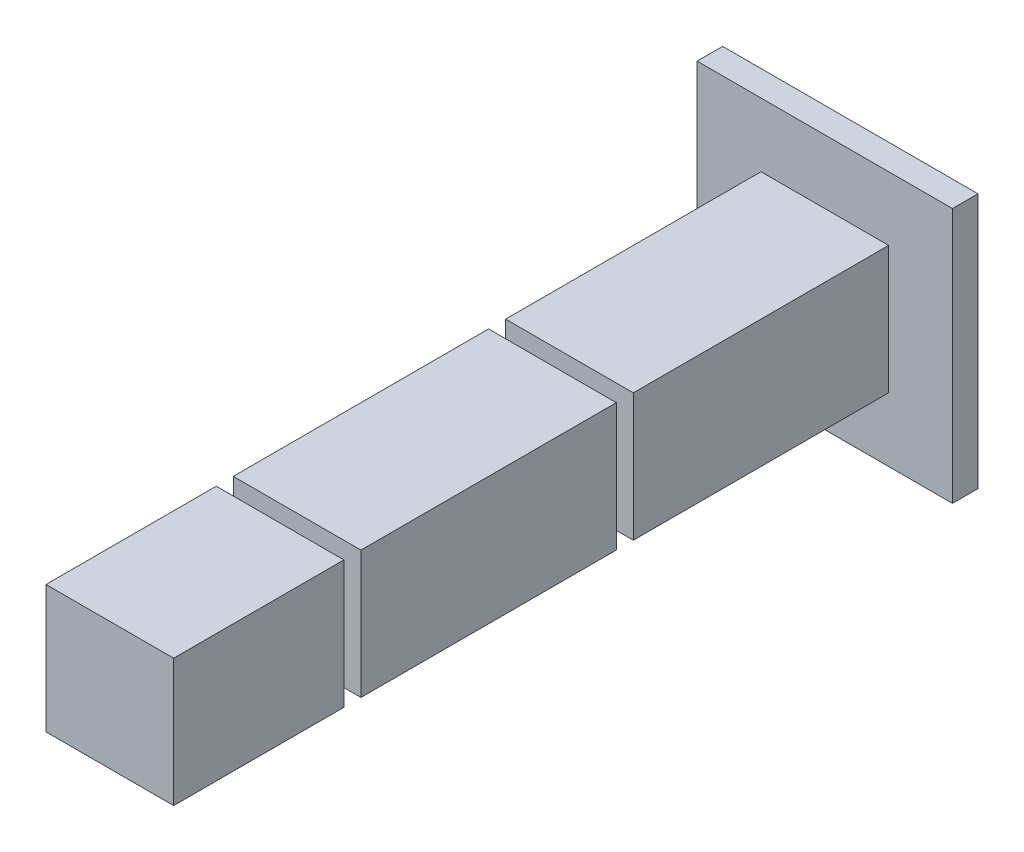
ISO-10303-21;
HEADER;
FILE_DESCRIPTION(('STEP AP214'),'2;1');
FILE_NAME('part.step','',(''),(''),'','','');
FILE_SCHEMA(('AUTOMOTIVE_DESIGN { 1 0 10303 214 1 1 1 1 }'));
ENDSEC;
DATA;
#1=APPLICATION_CONTEXT('core data for automotive mechanical design processes');
#2=APPLICATION_PROTOCOL_DEFINITION('international standard','automotive_design',2000,#1);
#3=PRODUCT_CONTEXT('',#1,'mechanical');
#4=PRODUCT('Part','Part','',(#3));
#5=PRODUCT_RELATED_PRODUCT_CATEGORY('part','',(#4));
#6=PRODUCT_DEFINITION_FORMATION('','',#4);
#7=PRODUCT_DEFINITION_CONTEXT('part definition',#1,'design');
#8=PRODUCT_DEFINITION('design','',#6,#7);
#9=PRODUCT_DEFINITION_SHAPE('','',#8);
#10=(LENGTH_UNIT() NAMED_UNIT(*) SI_UNIT(.MILLI.,.METRE.));
#11=(NAMED_UNIT(*) PLANE_ANGLE_UNIT() SI_UNIT($,.RADIAN.));
#12=(NAMED_UNIT(*) SI_UNIT($,.STERADIAN.) SOLID_ANGLE_UNIT());
#13=UNCERTAINTY_MEASURE_WITH_UNIT(LENGTH_MEASURE(1.E-05),#10,'distance_accuracy_value','');
#14=(GEOMETRIC_REPRESENTATION_CONTEXT(3) GLOBAL_UNCERTAINTY_ASSIGNED_CONTEXT((#13)) GLOBAL_UNIT_ASSIGNED_CONTEXT((#10,
#11,#12)) REPRESENTATION_CONTEXT('',''));
#15=CARTESIAN_POINT('',(0.,0.,0.));
#16=DIRECTION('',(0.,0.,1.));
#17=DIRECTION('',(1.,0.,0.));
#18=AXIS2_PLACEMENT_3D('',#15,#16,#17);
#19=CARTESIAN_POINT('',(0.,0.,157.5));
#20=DIRECTION('',(0.,0.,-1.));
#21=DIRECTION('',(-1.,0.,0.));
#22=AXIS2_PLACEMENT_3D('',#19,#20,#21);
#23=PLANE('',#22);
#24=DIRECTION('',(0.,1.,0.));
#25=VECTOR('',#24,1.);
#26=CARTESIAN_POINT('',(112.5,-37.5,157.5));
#27=LINE('',#26,#25);
#28=CARTESIAN_POINT('',(112.5,-37.5,157.5));
#29=VERTEX_POINT('',#28);
#30=CARTESIAN_POINT('',(112.5,37.5000000000001,157.5));
#31=VERTEX_POINT('',#30);
#32=EDGE_CURVE('E373',#29,#31,#27,.T.);
#33=ORIENTED_EDGE('',*,*,#32,.T.);
#34=DIRECTION('',(-1.,0.,0.));
#35=VECTOR('',#34,1.);
#36=CARTESIAN_POINT('',(37.5,37.5000000000001,157.5));
#37=LINE('',#36,#35);
#38=CARTESIAN_POINT('',(37.5,37.5000000000001,157.5));
#39=VERTEX_POINT('',#38);
#40=EDGE_CURVE('E377',#31,#39,#37,.T.);
#41=ORIENTED_EDGE('',*,*,#40,.T.);
#42=DIRECTION('',(0.,-1.,0.));
#43=VECTOR('',#42,1.);
#44=CARTESIAN_POINT('',(37.5,-37.5,157.5));
#45=LINE('',#44,#43);
#46=CARTESIAN_POINT('',(37.5,-37.5,157.5));
#47=VERTEX_POINT('',#46);
#48=EDGE_CURVE('E381',#39,#47,#45,.T.);
#49=ORIENTED_EDGE('',*,*,#48,.T.);
#50=DIRECTION('',(1.,0.,0.));
#51=VECTOR('',#50,1.);
#52=CARTESIAN_POINT('',(37.5,-37.5,157.5));
#53=LINE('',#52,#51);
#54=EDGE_CURVE('E384',#47,#29,#53,.T.);
#55=ORIENTED_EDGE('',*,*,#54,.T.);
#56=EDGE_LOOP('',(#33,#41,#49,#55));
#57=FACE_BOUND('',#56,.T.);
#58=DIRECTION('',(0.,1.,0.));
#59=VECTOR('',#58,1.);
#60=CARTESIAN_POINT('',(90.,-14.9999999999999,157.5));
#61=LINE('',#60,#59);
#62=CARTESIAN_POINT('',(90.,-14.9999999999999,157.5));
#63=VERTEX_POINT('',#62);
#64=CARTESIAN_POINT('',(90.,15.0000000000001,157.5));
#65=VERTEX_POINT('',#64);
#66=EDGE_CURVE('E324',#63,#65,#61,.T.);
#67=ORIENTED_EDGE('',*,*,#66,.F.);
#68=DIRECTION('',(1.,0.,0.));
#69=VECTOR('',#68,1.);
#70=CARTESIAN_POINT('',(60.,-14.9999999999999,157.5));
#71=LINE('',#70,#69);
#72=CARTESIAN_POINT('',(60.,-14.9999999999999,157.5));
#73=VERTEX_POINT('',#72);
#74=EDGE_CURVE('E330',#73,#63,#71,.T.);
#75=ORIENTED_EDGE('',*,*,#74,.F.);
#76=DIRECTION('',(0.,-1.,0.));
#77=VECTOR('',#76,1.);
#78=CARTESIAN_POINT('',(60.,-14.9999999999999,157.5));
#79=LINE('',#78,#77);
#80=CARTESIAN_POINT('',(60.,15.0000000000001,157.5));
#81=VERTEX_POINT('',#80);
#82=EDGE_CURVE('E350',#81,#73,#79,.T.);
#83=ORIENTED_EDGE('',*,*,#82,.F.);
#84=DIRECTION('',(-1.,0.,0.));
#85=VECTOR('',#84,1.);
#86=CARTESIAN_POINT('',(60.,15.0000000000001,157.5));
#87=LINE('',#86,#85);
#88=EDGE_CURVE('E346',#65,#81,#87,.T.);
#89=ORIENTED_EDGE('',*,*,#88,.F.);
#90=EDGE_LOOP('',(#67,#75,#83,#89));
#91=FACE_BOUND('',#90,.T.);
#92=ADVANCED_FACE('F45',(#57,#91),#23,.F.);
#93=CARTESIAN_POINT('',(150.,-75.,7.5));
#94=DIRECTION('',(0.,0.,-1.));
#95=DIRECTION('',(-1.,0.,0.));
#96=AXIS2_PLACEMENT_3D('',#93,#94,#95);
#97=PLANE('',#96);
#98=DIRECTION('',(0.,-1.,0.));
#99=VECTOR('',#98,1.);
#100=CARTESIAN_POINT('',(0.,-75.,7.5));
#101=LINE('',#100,#99);
#102=CARTESIAN_POINT('',(0.,75.,7.5));
#103=VERTEX_POINT('',#102);
#104=CARTESIAN_POINT('',(0.,-75.,7.5));
#105=VERTEX_POINT('',#104);
#106=EDGE_CURVE('E436',#103,#105,#101,.T.);
#107=ORIENTED_EDGE('',*,*,#106,.T.);
#108=DIRECTION('',(-1.,0.,0.));
#109=VECTOR('',#108,1.);
#110=CARTESIAN_POINT('',(150.,-75.,7.5));
#111=LINE('',#110,#109);
#112=CARTESIAN_POINT('',(150.,-75.,7.5));
#113=VERTEX_POINT('',#112);
#114=EDGE_CURVE('E54',#113,#105,#111,.T.);
#115=ORIENTED_EDGE('',*,*,#114,.F.);
#116=DIRECTION('',(0.,-1.,0.));
#117=VECTOR('',#116,1.);
#118=CARTESIAN_POINT('',(150.,-75.,7.5));
#119=LINE('',#118,#117);
#120=CARTESIAN_POINT('',(150.,75.,7.5));
#121=VERTEX_POINT('',#120);
#122=EDGE_CURVE('E422',#121,#113,#119,.T.);
#123=ORIENTED_EDGE('',*,*,#122,.F.);
#124=DIRECTION('',(-1.,0.,0.));
#125=VECTOR('',#124,1.);
#126=CARTESIAN_POINT('',(150.,75.,7.5));
#127=LINE('',#126,#125);
#128=EDGE_CURVE('E11',#121,#103,#127,.T.);
#129=ORIENTED_EDGE('',*,*,#128,.T.);
#130=EDGE_LOOP('',(#107,#115,#123,#129));
#131=FACE_BOUND('',#130,.T.);
#132=DIRECTION('',(0.,1.,0.));
#133=VECTOR('',#132,1.);
#134=CARTESIAN_POINT('',(112.5,-37.5,7.5));
#135=LINE('',#134,#133);
#136=CARTESIAN_POINT('',(112.5,-37.5,7.5));
#137=VERTEX_POINT('',#136);
#138=CARTESIAN_POINT('',(112.5,37.5000000000001,7.5));
#139=VERTEX_POINT('',#138);
#140=EDGE_CURVE('E372',#137,#139,#135,.T.);
#141=ORIENTED_EDGE('',*,*,#140,.F.);
#142=DIRECTION('',(1.,0.,0.));
#143=VECTOR('',#142,1.);
#144=CARTESIAN_POINT('',(37.5,-37.5,7.5));
#145=LINE('',#144,#143);
#146=CARTESIAN_POINT('',(37.5,-37.5,7.5));
#147=VERTEX_POINT('',#146);
#148=EDGE_CURVE('E378',#147,#137,#145,.T.);
#149=ORIENTED_EDGE('',*,*,#148,.F.);
#150=DIRECTION('',(0.,-1.,0.));
#151=VECTOR('',#150,1.);
#152=CARTESIAN_POINT('',(37.5,-37.5,7.5));
#153=LINE('',#152,#151);
#154=CARTESIAN_POINT('',(37.5,37.5000000000001,7.5));
#155=VERTEX_POINT('',#154);
#156=EDGE_CURVE('E395',#155,#147,#153,.T.);
#157=ORIENTED_EDGE('',*,*,#156,.F.);
#158=DIRECTION('',(-1.,0.,0.));
#159=VECTOR('',#158,1.);
#160=CARTESIAN_POINT('',(37.5,37.5000000000001,7.5));
#161=LINE('',#160,#159);
#162=EDGE_CURVE('E391',#139,#155,#161,.T.);
#163=ORIENTED_EDGE('',*,*,#162,.F.);
#164=EDGE_LOOP('',(#141,#149,#157,#163));
#165=FACE_BOUND('',#164,.T.);
#166=ADVANCED_FACE('F472',(#131,#165),#97,.F.);
#167=CARTESIAN_POINT('',(150.,75.,-7.5));
#168=DIRECTION('',(0.,-1.,0.));
#169=DIRECTION('',(0.,0.,-1.));
#170=AXIS2_PLACEMENT_3D('',#167,#168,#169);
#171=PLANE('',#170);
#172=DIRECTION('',(0.,0.,1.));
#173=VECTOR('',#172,1.);
#174=CARTESIAN_POINT('',(0.,75.,-7.5));
#175=LINE('',#174,#173);
#176=CARTESIAN_POINT('',(0.,75.,-7.5));
#177=VERTEX_POINT('',#176);
#178=EDGE_CURVE('E417',#177,#103,#175,.T.);
#179=ORIENTED_EDGE('',*,*,#178,.T.);
#180=ORIENTED_EDGE('',*,*,#128,.F.);
#181=DIRECTION('',(0.,0.,1.));
#182=VECTOR('',#181,1.);
#183=CARTESIAN_POINT('',(150.,75.,-7.5));
#184=LINE('',#183,#182);
#185=CARTESIAN_POINT('',(150.,75.,-7.5));
#186=VERTEX_POINT('',#185);
#187=EDGE_CURVE('E418',#186,#121,#184,.T.);
#188=ORIENTED_EDGE('',*,*,#187,.F.);
#189=DIRECTION('',(-1.,0.,0.));
#190=VECTOR('',#189,1.);
#191=CARTESIAN_POINT('',(150.,75.,-7.5));
#192=LINE('',#191,#190);
#193=EDGE_CURVE('E432',#186,#177,#192,.T.);
#194=ORIENTED_EDGE('',*,*,#193,.T.);
#195=EDGE_LOOP('',(#179,#180,#188,#194));
#196=FACE_BOUND('',#195,.T.);
#197=ADVANCED_FACE('F47',(#196),#171,.F.);
#198=CARTESIAN_POINT('',(150.,-75.,-7.5));
#199=DIRECTION('',(0.,1.,0.));
#200=DIRECTION('',(0.,0.,1.));
#201=AXIS2_PLACEMENT_3D('',#198,#199,#200);
#202=PLANE('',#201);
#203=DIRECTION('',(0.,0.,-1.));
#204=VECTOR('',#203,1.);
#205=CARTESIAN_POINT('',(0.,-75.,-7.5));
#206=LINE('',#205,#204);
#207=CARTESIAN_POINT('',(0.,-75.,-7.5));
#208=VERTEX_POINT('',#207);
#209=EDGE_CURVE('E439',#105,#208,#206,.T.);
#210=ORIENTED_EDGE('',*,*,#209,.T.);
#211=DIRECTION('',(-1.,0.,0.));
#212=VECTOR('',#211,1.);
#213=CARTESIAN_POINT('',(150.,-75.,-7.5));
#214=LINE('',#213,#212);
#215=CARTESIAN_POINT('',(150.,-75.,-7.5));
#216=VERTEX_POINT('',#215);
#217=EDGE_CURVE('E447',#216,#208,#214,.T.);
#218=ORIENTED_EDGE('',*,*,#217,.F.);
#219=DIRECTION('',(0.,0.,-1.));
#220=VECTOR('',#219,1.);
#221=CARTESIAN_POINT('',(150.,-75.,-7.5));
#222=LINE('',#221,#220);
#223=EDGE_CURVE('E426',#113,#216,#222,.T.);
#224=ORIENTED_EDGE('',*,*,#223,.F.);
#225=ORIENTED_EDGE('',*,*,#114,.T.);
#226=EDGE_LOOP('',(#210,#218,#224,#225));
#227=FACE_BOUND('',#226,.T.);
#228=ADVANCED_FACE('F456',(#227),#202,.F.);
#229=CARTESIAN_POINT('',(150.,-75.,-7.5));
#230=DIRECTION('',(0.,0.,1.));
#231=DIRECTION('',(1.,0.,0.));
#232=AXIS2_PLACEMENT_3D('',#229,#230,#231);
#233=PLANE('',#232);
#234=DIRECTION('',(0.,1.,0.));
#235=VECTOR('',#234,1.);
#236=CARTESIAN_POINT('',(0.,-75.,-7.5));
#237=LINE('',#236,#235);
#238=EDGE_CURVE('E423',#208,#177,#237,.T.);
#239=ORIENTED_EDGE('',*,*,#238,.T.);
#240=ORIENTED_EDGE('',*,*,#193,.F.);
#241=DIRECTION('',(0.,1.,0.));
#242=VECTOR('',#241,1.);
#243=CARTESIAN_POINT('',(150.,-75.,-7.5));
#244=LINE('',#243,#242);
#245=EDGE_CURVE('E429',#216,#186,#244,.T.);
#246=ORIENTED_EDGE('',*,*,#245,.F.);
#247=ORIENTED_EDGE('',*,*,#217,.T.);
#248=EDGE_LOOP('',(#239,#240,#246,#247));
#249=FACE_BOUND('',#248,.T.);
#250=ADVANCED_FACE('F465',(#249),#233,.F.);
#251=CARTESIAN_POINT('',(150.,0.,0.));
#252=DIRECTION('',(-1.,0.,0.));
#253=DIRECTION('',(0.,0.,1.));
#254=AXIS2_PLACEMENT_3D('',#251,#252,#253);
#255=PLANE('',#254);
#256=ORIENTED_EDGE('',*,*,#187,.T.);
#257=ORIENTED_EDGE('',*,*,#122,.T.);
#258=ORIENTED_EDGE('',*,*,#223,.T.);
#259=ORIENTED_EDGE('',*,*,#245,.T.);
#260=EDGE_LOOP('',(#256,#257,#258,#259));
#261=FACE_BOUND('',#260,.T.);
#262=ADVANCED_FACE('F471',(#261),#255,.F.);
#263=CARTESIAN_POINT('',(0.,0.,0.));
#264=DIRECTION('',(-1.,0.,0.));
#265=DIRECTION('',(0.,0.,1.));
#266=AXIS2_PLACEMENT_3D('',#263,#264,#265);
#267=PLANE('',#266);
#268=ORIENTED_EDGE('',*,*,#178,.F.);
#269=ORIENTED_EDGE('',*,*,#238,.F.);
#270=ORIENTED_EDGE('',*,*,#209,.F.);
#271=ORIENTED_EDGE('',*,*,#106,.F.);
#272=EDGE_LOOP('',(#268,#269,#270,#271));
#273=FACE_BOUND('',#272,.T.);
#274=ADVANCED_FACE('F462',(#273),#267,.T.);
#275=CARTESIAN_POINT('',(112.5,-37.5,157.5));
#276=DIRECTION('',(-1.,0.,0.));
#277=DIRECTION('',(0.,0.,1.));
#278=AXIS2_PLACEMENT_3D('',#275,#276,#277);
#279=PLANE('',#278);
#280=ORIENTED_EDGE('',*,*,#140,.T.);
#281=DIRECTION('',(0.,0.,-1.));
#282=VECTOR('',#281,1.);
#283=CARTESIAN_POINT('',(112.5,37.5000000000001,157.5));
#284=LINE('',#283,#282);
#285=EDGE_CURVE('E413',#31,#139,#284,.T.);
#286=ORIENTED_EDGE('',*,*,#285,.F.);
#287=ORIENTED_EDGE('',*,*,#32,.F.);
#288=DIRECTION('',(0.,0.,-1.));
#289=VECTOR('',#288,1.);
#290=CARTESIAN_POINT('',(112.5,-37.5,157.5));
#291=LINE('',#290,#289);
#292=EDGE_CURVE('E387',#29,#137,#291,.T.);
#293=ORIENTED_EDGE('',*,*,#292,.T.);
#294=EDGE_LOOP('',(#280,#286,#287,#293));
#295=FACE_BOUND('',#294,.T.);
#296=ADVANCED_FACE('F483',(#295),#279,.F.);
#297=CARTESIAN_POINT('',(37.5,37.5000000000001,157.5));
#298=DIRECTION('',(0.,-1.,0.));
#299=DIRECTION('',(0.,0.,-1.));
#300=AXIS2_PLACEMENT_3D('',#297,#298,#299);
#301=PLANE('',#300);
#302=ORIENTED_EDGE('',*,*,#162,.T.);
#303=DIRECTION('',(0.,0.,-1.));
#304=VECTOR('',#303,1.);
#305=CARTESIAN_POINT('',(37.5,37.5000000000001,157.5));
#306=LINE('',#305,#304);
#307=EDGE_CURVE('E409',#39,#155,#306,.T.);
#308=ORIENTED_EDGE('',*,*,#307,.F.);
#309=ORIENTED_EDGE('',*,*,#40,.F.);
#310=ORIENTED_EDGE('',*,*,#285,.T.);
#311=EDGE_LOOP('',(#302,#308,#309,#310));
#312=FACE_BOUND('',#311,.T.);
#313=ADVANCED_FACE('F491',(#312),#301,.F.);
#314=CARTESIAN_POINT('',(37.5,-37.5,157.5));
#315=DIRECTION('',(1.,0.,0.));
#316=DIRECTION('',(0.,0.,-1.));
#317=AXIS2_PLACEMENT_3D('',#314,#315,#316);
#318=PLANE('',#317);
#319=ORIENTED_EDGE('',*,*,#156,.T.);
#320=DIRECTION('',(0.,0.,-1.));
#321=VECTOR('',#320,1.);
#322=CARTESIAN_POINT('',(37.5,-37.5,157.5));
#323=LINE('',#322,#321);
#324=EDGE_CURVE('E405',#47,#147,#323,.T.);
#325=ORIENTED_EDGE('',*,*,#324,.F.);
#326=ORIENTED_EDGE('',*,*,#48,.F.);
#327=ORIENTED_EDGE('',*,*,#307,.T.);
#328=EDGE_LOOP('',(#319,#325,#326,#327));
#329=FACE_BOUND('',#328,.T.);
#330=ADVANCED_FACE('F489',(#329),#318,.F.);
#331=CARTESIAN_POINT('',(37.5,-37.5,157.5));
#332=DIRECTION('',(0.,1.,0.));
#333=DIRECTION('',(0.,0.,1.));
#334=AXIS2_PLACEMENT_3D('',#331,#332,#333);
#335=PLANE('',#334);
#336=ORIENTED_EDGE('',*,*,#148,.T.);
#337=ORIENTED_EDGE('',*,*,#292,.F.);
#338=ORIENTED_EDGE('',*,*,#54,.F.);
#339=ORIENTED_EDGE('',*,*,#324,.T.);
#340=EDGE_LOOP('',(#336,#337,#338,#339));
#341=FACE_BOUND('',#340,.T.);
#342=ADVANCED_FACE('F479',(#341),#335,.F.);
#343=CARTESIAN_POINT('',(90.,-14.9999999999999,167.5));
#344=DIRECTION('',(-1.,0.,0.));
#345=DIRECTION('',(0.,0.,1.));
#346=AXIS2_PLACEMENT_3D('',#343,#344,#345);
#347=PLANE('',#346);
#348=ORIENTED_EDGE('',*,*,#66,.T.);
#349=DIRECTION('',(0.,0.,-1.));
#350=VECTOR('',#349,1.);
#351=CARTESIAN_POINT('',(90.,15.0000000000001,167.5));
#352=LINE('',#351,#350);
#353=CARTESIAN_POINT('',(90.,15.0000000000001,167.5));
#354=VERTEX_POINT('',#353);
#355=EDGE_CURVE('E368',#354,#65,#352,.T.);
#356=ORIENTED_EDGE('',*,*,#355,.F.);
#357=DIRECTION('',(0.,1.,0.));
#358=VECTOR('',#357,1.);
#359=CARTESIAN_POINT('',(90.,-14.9999999999999,167.5));
#360=LINE('',#359,#358);
#361=CARTESIAN_POINT('',(90.,-14.9999999999999,167.5));
#362=VERTEX_POINT('',#361);
#363=EDGE_CURVE('E325',#362,#354,#360,.T.);
#364=ORIENTED_EDGE('',*,*,#363,.F.);
#365=DIRECTION('',(0.,0.,-1.));
#366=VECTOR('',#365,1.);
#367=CARTESIAN_POINT('',(90.,-14.9999999999999,167.5));
#368=LINE('',#367,#366);
#369=EDGE_CURVE('E342',#362,#63,#368,.T.);
#370=ORIENTED_EDGE('',*,*,#369,.T.);
#371=EDGE_LOOP('',(#348,#356,#364,#370));
#372=FACE_BOUND('',#371,.T.);
#373=ADVANCED_FACE('F508',(#372),#347,.F.);
#374=CARTESIAN_POINT('',(60.,15.0000000000001,167.5));
#375=DIRECTION('',(0.,-1.,0.));
#376=DIRECTION('',(0.,0.,-1.));
#377=AXIS2_PLACEMENT_3D('',#374,#375,#376);
#378=PLANE('',#377);
#379=ORIENTED_EDGE('',*,*,#88,.T.);
#380=DIRECTION('',(0.,0.,-1.));
#381=VECTOR('',#380,1.);
#382=CARTESIAN_POINT('',(60.,15.0000000000001,167.5));
#383=LINE('',#382,#381);
#384=CARTESIAN_POINT('',(60.,15.0000000000001,167.5));
#385=VERTEX_POINT('',#384);
#386=EDGE_CURVE('E364',#385,#81,#383,.T.);
#387=ORIENTED_EDGE('',*,*,#386,.F.);
#388=DIRECTION('',(-1.,0.,0.));
#389=VECTOR('',#388,1.);
#390=CARTESIAN_POINT('',(60.,15.0000000000001,167.5));
#391=LINE('',#390,#389);
#392=EDGE_CURVE('E329',#354,#385,#391,.T.);
#393=ORIENTED_EDGE('',*,*,#392,.F.);
#394=ORIENTED_EDGE('',*,*,#355,.T.);
#395=EDGE_LOOP('',(#379,#387,#393,#394));
#396=FACE_BOUND('',#395,.T.);
#397=ADVANCED_FACE('F512',(#396),#378,.F.);
#398=CARTESIAN_POINT('',(60.,-14.9999999999999,167.5));
#399=DIRECTION('',(1.,0.,0.));
#400=DIRECTION('',(0.,0.,-1.));
#401=AXIS2_PLACEMENT_3D('',#398,#399,#400);
#402=PLANE('',#401);
#403=ORIENTED_EDGE('',*,*,#82,.T.);
#404=DIRECTION('',(0.,0.,-1.));
#405=VECTOR('',#404,1.);
#406=CARTESIAN_POINT('',(60.,-14.9999999999999,167.5));
#407=LINE('',#406,#405);
#408=CARTESIAN_POINT('',(60.,-14.9999999999999,167.5));
#409=VERTEX_POINT('',#408);
#410=EDGE_CURVE('E360',#409,#73,#407,.T.);
#411=ORIENTED_EDGE('',*,*,#410,.F.);
#412=DIRECTION('',(0.,-1.,0.));
#413=VECTOR('',#412,1.);
#414=CARTESIAN_POINT('',(60.,-14.9999999999999,167.5));
#415=LINE('',#414,#413);
#416=EDGE_CURVE('E334',#385,#409,#415,.T.);
#417=ORIENTED_EDGE('',*,*,#416,.F.);
#418=ORIENTED_EDGE('',*,*,#386,.T.);
#419=EDGE_LOOP('',(#403,#411,#417,#418));
#420=FACE_BOUND('',#419,.T.);
#421=ADVANCED_FACE('F517',(#420),#402,.F.);
#422=CARTESIAN_POINT('',(60.,-14.9999999999999,167.5));
#423=DIRECTION('',(0.,1.,0.));
#424=DIRECTION('',(0.,0.,1.));
#425=AXIS2_PLACEMENT_3D('',#422,#423,#424);
#426=PLANE('',#425);
#427=ORIENTED_EDGE('',*,*,#74,.T.);
#428=ORIENTED_EDGE('',*,*,#369,.F.);
#429=DIRECTION('',(1.,0.,0.));
#430=VECTOR('',#429,1.);
#431=CARTESIAN_POINT('',(60.,-14.9999999999999,167.5));
#432=LINE('',#431,#430);
#433=EDGE_CURVE('E338',#409,#362,#432,.T.);
#434=ORIENTED_EDGE('',*,*,#433,.F.);
#435=ORIENTED_EDGE('',*,*,#410,.T.);
#436=EDGE_LOOP('',(#427,#428,#434,#435));
#437=FACE_BOUND('',#436,.T.);
#438=ADVANCED_FACE('F522',(#437),#426,.F.);
#439=CARTESIAN_POINT('',(0.,0.,167.5));
#440=DIRECTION('',(0.,0.,1.));
#441=DIRECTION('',(1.,0.,0.));
#442=AXIS2_PLACEMENT_3D('',#439,#440,#441);
#443=PLANE('',#442);
#444=DIRECTION('',(1.,0.,0.));
#445=VECTOR('',#444,1.);
#446=CARTESIAN_POINT('',(37.5,-37.5,167.5));
#447=LINE('',#446,#445);
#448=CARTESIAN_POINT('',(37.5,-37.5,167.5));
#449=VERTEX_POINT('',#448);
#450=CARTESIAN_POINT('',(112.5,-37.5,167.5));
#451=VERTEX_POINT('',#450);
#452=EDGE_CURVE('E282',#449,#451,#447,.T.);
#453=ORIENTED_EDGE('',*,*,#452,.F.);
#454=DIRECTION('',(0.,-1.,0.));
#455=VECTOR('',#454,1.);
#456=CARTESIAN_POINT('',(37.5,37.5000000000001,167.5));
#457=LINE('',#456,#455);
#458=CARTESIAN_POINT('',(37.5,37.5000000000001,167.5));
#459=VERTEX_POINT('',#458);
#460=EDGE_CURVE('E288',#459,#449,#457,.T.);
#461=ORIENTED_EDGE('',*,*,#460,.F.);
#462=DIRECTION('',(-1.,0.,0.));
#463=VECTOR('',#462,1.);
#464=CARTESIAN_POINT('',(112.5,37.5000000000001,167.5));
#465=LINE('',#464,#463);
#466=CARTESIAN_POINT('',(112.5,37.5000000000001,167.5));
#467=VERTEX_POINT('',#466);
#468=EDGE_CURVE('E304',#467,#459,#465,.T.);
#469=ORIENTED_EDGE('',*,*,#468,.F.);
#470=DIRECTION('',(0.,1.,0.));
#471=VECTOR('',#470,1.);
#472=CARTESIAN_POINT('',(112.5,-37.5,167.5));
#473=LINE('',#472,#471);
#474=EDGE_CURVE('E301',#451,#467,#473,.T.);
#475=ORIENTED_EDGE('',*,*,#474,.F.);
#476=EDGE_LOOP('',(#453,#461,#469,#475));
#477=FACE_BOUND('',#476,.T.);
#478=ORIENTED_EDGE('',*,*,#433,.T.);
#479=ORIENTED_EDGE('',*,*,#363,.T.);
#480=ORIENTED_EDGE('',*,*,#392,.T.);
#481=ORIENTED_EDGE('',*,*,#416,.T.);
#482=EDGE_LOOP('',(#478,#479,#480,#481));
#483=FACE_BOUND('',#482,.T.);
#484=ADVANCED_FACE('F527',(#477,#483),#443,.F.);
#485=CARTESIAN_POINT('',(37.5,-37.5,317.5));
#486=DIRECTION('',(0.,1.,0.));
#487=DIRECTION('',(0.,0.,1.));
#488=AXIS2_PLACEMENT_3D('',#485,#486,#487);
#489=PLANE('',#488);
#490=ORIENTED_EDGE('',*,*,#452,.T.);
#491=DIRECTION('',(0.,0.,-1.));
#492=VECTOR('',#491,1.);
#493=CARTESIAN_POINT('',(112.5,-37.5,317.5));
#494=LINE('',#493,#492);
#495=CARTESIAN_POINT('',(112.5,-37.5,317.5));
#496=VERTEX_POINT('',#495);
#497=EDGE_CURVE('E320',#496,#451,#494,.T.);
#498=ORIENTED_EDGE('',*,*,#497,.F.);
#499=DIRECTION('',(1.,0.,0.));
#500=VECTOR('',#499,1.);
#501=CARTESIAN_POINT('',(37.5,-37.5,317.5));
#502=LINE('',#501,#500);
#503=CARTESIAN_POINT('',(37.5,-37.5,317.5));
#504=VERTEX_POINT('',#503);
#505=EDGE_CURVE('E283',#504,#496,#502,.T.);
#506=ORIENTED_EDGE('',*,*,#505,.F.);
#507=DIRECTION('',(0.,0.,-1.));
#508=VECTOR('',#507,1.);
#509=CARTESIAN_POINT('',(37.5,-37.5,317.5));
#510=LINE('',#509,#508);
#511=EDGE_CURVE('E297',#504,#449,#510,.T.);
#512=ORIENTED_EDGE('',*,*,#511,.T.);
#513=EDGE_LOOP('',(#490,#498,#506,#512));
#514=FACE_BOUND('',#513,.T.);
#515=ADVANCED_FACE('F529',(#514),#489,.F.);
#516=CARTESIAN_POINT('',(112.5,-37.5,317.5));
#517=DIRECTION('',(-1.,0.,0.));
#518=DIRECTION('',(0.,0.,1.));
#519=AXIS2_PLACEMENT_3D('',#516,#517,#518);
#520=PLANE('',#519);
#521=ORIENTED_EDGE('',*,*,#474,.T.);
#522=DIRECTION('',(0.,0.,-1.));
#523=VECTOR('',#522,1.);
#524=CARTESIAN_POINT('',(112.5,37.5000000000001,317.5));
#525=LINE('',#524,#523);
#526=CARTESIAN_POINT('',(112.5,37.5000000000001,317.5));
#527=VERTEX_POINT('',#526);
#528=EDGE_CURVE('E316',#527,#467,#525,.T.);
#529=ORIENTED_EDGE('',*,*,#528,.F.);
#530=DIRECTION('',(0.,1.,0.));
#531=VECTOR('',#530,1.);
#532=CARTESIAN_POINT('',(112.5,-37.5,317.5));
#533=LINE('',#532,#531);
#534=EDGE_CURVE('E287',#496,#527,#533,.T.);
#535=ORIENTED_EDGE('',*,*,#534,.F.);
#536=ORIENTED_EDGE('',*,*,#497,.T.);
#537=EDGE_LOOP('',(#521,#529,#535,#536));
#538=FACE_BOUND('',#537,.T.);
#539=ADVANCED_FACE('F536',(#538),#520,.F.);
#540=CARTESIAN_POINT('',(112.5,37.5000000000001,317.5));
#541=DIRECTION('',(0.,-1.,0.));
#542=DIRECTION('',(0.,0.,-1.));
#543=AXIS2_PLACEMENT_3D('',#540,#541,#542);
#544=PLANE('',#543);
#545=ORIENTED_EDGE('',*,*,#468,.T.);
#546=DIRECTION('',(0.,0.,-1.));
#547=VECTOR('',#546,1.);
#548=CARTESIAN_POINT('',(37.5,37.5000000000001,317.5));
#549=LINE('',#548,#547);
#550=CARTESIAN_POINT('',(37.5,37.5000000000001,317.5));
#551=VERTEX_POINT('',#550);
#552=EDGE_CURVE('E312',#551,#459,#549,.T.);
#553=ORIENTED_EDGE('',*,*,#552,.F.);
#554=DIRECTION('',(-1.,0.,0.));
#555=VECTOR('',#554,1.);
#556=CARTESIAN_POINT('',(112.5,37.5000000000001,317.5));
#557=LINE('',#556,#555);
#558=EDGE_CURVE('E291',#527,#551,#557,.T.);
#559=ORIENTED_EDGE('',*,*,#558,.F.);
#560=ORIENTED_EDGE('',*,*,#528,.T.);
#561=EDGE_LOOP('',(#545,#553,#559,#560));
#562=FACE_BOUND('',#561,.T.);
#563=ADVANCED_FACE('F548',(#562),#544,.F.);
#564=CARTESIAN_POINT('',(37.5,37.5000000000001,317.5));
#565=DIRECTION('',(1.,0.,0.));
#566=DIRECTION('',(0.,0.,-1.));
#567=AXIS2_PLACEMENT_3D('',#564,#565,#566);
#568=PLANE('',#567);
#569=ORIENTED_EDGE('',*,*,#460,.T.);
#570=ORIENTED_EDGE('',*,*,#511,.F.);
#571=DIRECTION('',(0.,-1.,0.));
#572=VECTOR('',#571,1.);
#573=CARTESIAN_POINT('',(37.5,37.5000000000001,317.5));
#574=LINE('',#573,#572);
#575=EDGE_CURVE('E294',#551,#504,#574,.T.);
#576=ORIENTED_EDGE('',*,*,#575,.F.);
#577=ORIENTED_EDGE('',*,*,#552,.T.);
#578=EDGE_LOOP('',(#569,#570,#576,#577));
#579=FACE_BOUND('',#578,.T.);
#580=ADVANCED_FACE('F545',(#579),#568,.F.);
#581=CARTESIAN_POINT('',(0.,0.,317.5));
#582=DIRECTION('',(0.,0.,1.));
#583=DIRECTION('',(1.,0.,0.));
#584=AXIS2_PLACEMENT_3D('',#581,#582,#583);
#585=PLANE('',#584);
#586=DIRECTION('',(0.,1.,0.));
#587=VECTOR('',#586,1.);
#588=CARTESIAN_POINT('',(90.,-14.9999999999999,317.5));
#589=LINE('',#588,#587);
#590=CARTESIAN_POINT('',(90.,-14.9999999999999,317.5));
#591=VERTEX_POINT('',#590);
#592=CARTESIAN_POINT('',(90.,15.0000000000001,317.5));
#593=VERTEX_POINT('',#592);
#594=EDGE_CURVE('E61',#591,#593,#589,.T.);
#595=ORIENTED_EDGE('',*,*,#594,.F.);
#596=DIRECTION('',(1.,0.,0.));
#597=VECTOR('',#596,1.);
#598=CARTESIAN_POINT('',(60.,-14.9999999999999,317.5));
#599=LINE('',#598,#597);
#600=CARTESIAN_POINT('',(60.,-14.9999999999999,317.5));
#601=VERTEX_POINT('',#600);
#602=EDGE_CURVE('E65',#601,#591,#599,.T.);
#603=ORIENTED_EDGE('',*,*,#602,.F.);
#604=DIRECTION('',(0.,-1.,0.));
#605=VECTOR('',#604,1.);
#606=CARTESIAN_POINT('',(60.,-14.9999999999999,317.5));
#607=LINE('',#606,#605);
#608=CARTESIAN_POINT('',(60.,15.0000000000001,317.5));
#609=VERTEX_POINT('',#608);
#610=EDGE_CURVE('E262',#609,#601,#607,.T.);
#611=ORIENTED_EDGE('',*,*,#610,.F.);
#612=DIRECTION('',(-1.,0.,0.));
#613=VECTOR('',#612,1.);
#614=CARTESIAN_POINT('',(60.,15.0000000000001,317.5));
#615=LINE('',#614,#613);
#616=EDGE_CURVE('E236',#593,#609,#615,.T.);
#617=ORIENTED_EDGE('',*,*,#616,.F.);
#618=EDGE_LOOP('',(#595,#603,#611,#617));
#619=FACE_BOUND('',#618,.T.);
#620=ORIENTED_EDGE('',*,*,#505,.T.);
#621=ORIENTED_EDGE('',*,*,#534,.T.);
#622=ORIENTED_EDGE('',*,*,#558,.T.);
#623=ORIENTED_EDGE('',*,*,#575,.T.);
#624=EDGE_LOOP('',(#620,#621,#622,#623));
#625=FACE_BOUND('',#624,.T.);
#626=ADVANCED_FACE('F543',(#619,#625),#585,.T.);
#627=CARTESIAN_POINT('',(90.,-14.9999999999999,327.5));
#628=DIRECTION('',(-1.,0.,0.));
#629=DIRECTION('',(0.,0.,1.));
#630=AXIS2_PLACEMENT_3D('',#627,#628,#629);
#631=PLANE('',#630);
#632=ORIENTED_EDGE('',*,*,#594,.T.);
#633=DIRECTION('',(0.,0.,-1.));
#634=VECTOR('',#633,1.);
#635=CARTESIAN_POINT('',(90.,15.0000000000001,327.5));
#636=LINE('',#635,#634);
#637=CARTESIAN_POINT('',(90.,15.0000000000001,327.5));
#638=VERTEX_POINT('',#637);
#639=EDGE_CURVE('E278',#638,#593,#636,.T.);
#640=ORIENTED_EDGE('',*,*,#639,.F.);
#641=DIRECTION('',(0.,1.,0.));
#642=VECTOR('',#641,1.);
#643=CARTESIAN_POINT('',(90.,-14.9999999999999,327.5));
#644=LINE('',#643,#642);
#645=CARTESIAN_POINT('',(90.,-14.9999999999999,327.5));
#646=VERTEX_POINT('',#645);
#647=EDGE_CURVE('E242',#646,#638,#644,.T.);
#648=ORIENTED_EDGE('',*,*,#647,.F.);
#649=DIRECTION('',(0.,0.,-1.));
#650=VECTOR('',#649,1.);
#651=CARTESIAN_POINT('',(90.,-14.9999999999999,327.5));
#652=LINE('',#651,#650);
#653=EDGE_CURVE('E257',#646,#591,#652,.T.);
#654=ORIENTED_EDGE('',*,*,#653,.T.);
#655=EDGE_LOOP('',(#632,#640,#648,#654));
#656=FACE_BOUND('',#655,.T.);
#657=ADVANCED_FACE('F604',(#656),#631,.F.);
#658=CARTESIAN_POINT('',(60.,15.0000000000001,327.5));
#659=DIRECTION('',(0.,-1.,0.));
#660=DIRECTION('',(0.,0.,-1.));
#661=AXIS2_PLACEMENT_3D('',#658,#659,#660);
#662=PLANE('',#661);
#663=ORIENTED_EDGE('',*,*,#616,.T.);
#664=DIRECTION('',(0.,0.,-1.));
#665=VECTOR('',#664,1.);
#666=CARTESIAN_POINT('',(60.,15.0000000000001,327.5));
#667=LINE('',#666,#665);
#668=CARTESIAN_POINT('',(60.,15.0000000000001,327.5));
#669=VERTEX_POINT('',#668);
#670=EDGE_CURVE('E274',#669,#609,#667,.T.);
#671=ORIENTED_EDGE('',*,*,#670,.F.);
#672=DIRECTION('',(-1.,0.,0.));
#673=VECTOR('',#672,1.);
#674=CARTESIAN_POINT('',(60.,15.0000000000001,327.5));
#675=LINE('',#674,#673);
#676=EDGE_CURVE('E246',#638,#669,#675,.T.);
#677=ORIENTED_EDGE('',*,*,#676,.F.);
#678=ORIENTED_EDGE('',*,*,#639,.T.);
#679=EDGE_LOOP('',(#663,#671,#677,#678));
#680=FACE_BOUND('',#679,.T.);
#681=ADVANCED_FACE('F612',(#680),#662,.F.);
#682=CARTESIAN_POINT('',(60.,-14.9999999999999,327.5));
#683=DIRECTION('',(1.,0.,0.));
#684=DIRECTION('',(0.,0.,-1.));
#685=AXIS2_PLACEMENT_3D('',#682,#683,#684);
#686=PLANE('',#685);
#687=ORIENTED_EDGE('',*,*,#610,.T.);
#688=DIRECTION('',(0.,0.,-1.));
#689=VECTOR('',#688,1.);
#690=CARTESIAN_POINT('',(60.,-14.9999999999999,327.5));
#691=LINE('',#690,#689);
#692=CARTESIAN_POINT('',(60.,-14.9999999999999,327.5));
#693=VERTEX_POINT('',#692);
#694=EDGE_CURVE('E270',#693,#601,#691,.T.);
#695=ORIENTED_EDGE('',*,*,#694,.F.);
#696=DIRECTION('',(0.,-1.,0.));
#697=VECTOR('',#696,1.);
#698=CARTESIAN_POINT('',(60.,-14.9999999999999,327.5));
#699=LINE('',#698,#697);
#700=EDGE_CURVE('E250',#669,#693,#699,.T.);
#701=ORIENTED_EDGE('',*,*,#700,.F.);
#702=ORIENTED_EDGE('',*,*,#670,.T.);
#703=EDGE_LOOP('',(#687,#695,#701,#702));
#704=FACE_BOUND('',#703,.T.);
#705=ADVANCED_FACE('F621',(#704),#686,.F.);
#706=CARTESIAN_POINT('',(60.,-14.9999999999999,327.5));
#707=DIRECTION('',(0.,1.,0.));
#708=DIRECTION('',(0.,0.,1.));
#709=AXIS2_PLACEMENT_3D('',#706,#707,#708);
#710=PLANE('',#709);
#711=ORIENTED_EDGE('',*,*,#602,.T.);
#712=ORIENTED_EDGE('',*,*,#653,.F.);
#713=DIRECTION('',(1.,0.,0.));
#714=VECTOR('',#713,1.);
#715=CARTESIAN_POINT('',(60.,-14.9999999999999,327.5));
#716=LINE('',#715,#714);
#717=EDGE_CURVE('E254',#693,#646,#716,.T.);
#718=ORIENTED_EDGE('',*,*,#717,.F.);
#719=ORIENTED_EDGE('',*,*,#694,.T.);
#720=EDGE_LOOP('',(#711,#712,#718,#719));
#721=FACE_BOUND('',#720,.T.);
#722=ADVANCED_FACE('F631',(#721),#710,.F.);
#723=CARTESIAN_POINT('',(0.,0.,327.5));
#724=DIRECTION('',(0.,0.,1.));
#725=DIRECTION('',(1.,0.,0.));
#726=AXIS2_PLACEMENT_3D('',#723,#724,#725);
#727=PLANE('',#726);
#728=DIRECTION('',(-1.,0.,0.));
#729=VECTOR('',#728,1.);
#730=CARTESIAN_POINT('',(112.5,37.5000000000001,327.5));
#731=LINE('',#730,#729);
#732=CARTESIAN_POINT('',(112.5,37.5000000000001,327.5));
#733=VERTEX_POINT('',#732);
#734=CARTESIAN_POINT('',(37.5,37.5000000000001,327.5));
#735=VERTEX_POINT('',#734);
#736=EDGE_CURVE('E231',#733,#735,#731,.T.);
#737=ORIENTED_EDGE('',*,*,#736,.F.);
#738=DIRECTION('',(0.,1.,0.));
#739=VECTOR('',#738,1.);
#740=CARTESIAN_POINT('',(112.5,-37.5,327.5));
#741=LINE('',#740,#739);
#742=CARTESIAN_POINT('',(112.5,-37.5,327.5));
#743=VERTEX_POINT('',#742);
#744=EDGE_CURVE('E227',#743,#733,#741,.T.);
#745=ORIENTED_EDGE('',*,*,#744,.F.);
#746=DIRECTION('',(1.,0.,0.));
#747=VECTOR('',#746,1.);
#748=CARTESIAN_POINT('',(37.5,-37.5,327.5));
#749=LINE('',#748,#747);
#750=CARTESIAN_POINT('',(37.5,-37.5,327.5));
#751=VERTEX_POINT('',#750);
#752=EDGE_CURVE('E704',#751,#743,#749,.T.);
#753=ORIENTED_EDGE('',*,*,#752,.F.);
#754=DIRECTION('',(0.,-1.,0.));
#755=VECTOR('',#754,1.);
#756=CARTESIAN_POINT('',(37.5,37.5000000000001,327.5));
#757=LINE('',#756,#755);
#758=EDGE_CURVE('E709',#735,#751,#757,.T.);
#759=ORIENTED_EDGE('',*,*,#758,.F.);
#760=EDGE_LOOP('',(#737,#745,#753,#759));
#761=FACE_BOUND('',#760,.T.);
#762=ORIENTED_EDGE('',*,*,#717,.T.);
#763=ORIENTED_EDGE('',*,*,#647,.T.);
#764=ORIENTED_EDGE('',*,*,#676,.T.);
#765=ORIENTED_EDGE('',*,*,#700,.T.);
#766=EDGE_LOOP('',(#762,#763,#764,#765));
#767=FACE_BOUND('',#766,.T.);
#768=ADVANCED_FACE('F641',(#761,#767),#727,.F.);
#769=CARTESIAN_POINT('',(112.5,37.5000000000001,427.5));
#770=DIRECTION('',(0.,-1.,0.));
#771=DIRECTION('',(0.,0.,-1.));
#772=AXIS2_PLACEMENT_3D('',#769,#770,#771);
#773=PLANE('',#772);
#774=ORIENTED_EDGE('',*,*,#736,.T.);
#775=DIRECTION('',(0.,0.,-1.));
#776=VECTOR('',#775,1.);
#777=CARTESIAN_POINT('',(37.5,37.5000000000001,427.5));
#778=LINE('',#777,#776);
#779=CARTESIAN_POINT('',(37.5,37.5000000000001,427.5));
#780=VERTEX_POINT('',#779);
#781=EDGE_CURVE('E209',#780,#735,#778,.T.);
#782=ORIENTED_EDGE('',*,*,#781,.F.);
#783=DIRECTION('',(-1.,0.,0.));
#784=VECTOR('',#783,1.);
#785=CARTESIAN_POINT('',(112.5,37.5000000000001,427.5));
#786=LINE('',#785,#784);
#787=CARTESIAN_POINT('',(112.5,37.5000000000001,427.5));
#788=VERTEX_POINT('',#787);
#789=EDGE_CURVE('E217',#788,#780,#786,.T.);
#790=ORIENTED_EDGE('',*,*,#789,.F.);
#791=DIRECTION('',(0.,0.,-1.));
#792=VECTOR('',#791,1.);
#793=CARTESIAN_POINT('',(112.5,37.5000000000001,427.5));
#794=LINE('',#793,#792);
#795=EDGE_CURVE('E700',#788,#733,#794,.T.);
#796=ORIENTED_EDGE('',*,*,#795,.T.);
#797=EDGE_LOOP('',(#774,#782,#790,#796));
#798=FACE_BOUND('',#797,.T.);
#799=ADVANCED_FACE('F229',(#798),#773,.F.);
#800=CARTESIAN_POINT('',(37.5,37.5000000000001,427.5));
#801=DIRECTION('',(1.,0.,0.));
#802=DIRECTION('',(0.,0.,-1.));
#803=AXIS2_PLACEMENT_3D('',#800,#801,#802);
#804=PLANE('',#803);
#805=ORIENTED_EDGE('',*,*,#758,.T.);
#806=DIRECTION('',(0.,0.,-1.));
#807=VECTOR('',#806,1.);
#808=CARTESIAN_POINT('',(37.5,-37.5,427.5));
#809=LINE('',#808,#807);
#810=CARTESIAN_POINT('',(37.5,-37.5,427.5));
#811=VERTEX_POINT('',#810);
#812=EDGE_CURVE('E212',#811,#751,#809,.T.);
#813=ORIENTED_EDGE('',*,*,#812,.F.);
#814=DIRECTION('',(0.,-1.,0.));
#815=VECTOR('',#814,1.);
#816=CARTESIAN_POINT('',(37.5,37.5000000000001,427.5));
#817=LINE('',#816,#815);
#818=EDGE_CURVE('E205',#780,#811,#817,.T.);
#819=ORIENTED_EDGE('',*,*,#818,.F.);
#820=ORIENTED_EDGE('',*,*,#781,.T.);
#821=EDGE_LOOP('',(#805,#813,#819,#820));
#822=FACE_BOUND('',#821,.T.);
#823=ADVANCED_FACE('F207',(#822),#804,.F.);
#824=CARTESIAN_POINT('',(37.5,-37.5,427.5));
#825=DIRECTION('',(0.,1.,0.));
#826=DIRECTION('',(0.,0.,1.));
#827=AXIS2_PLACEMENT_3D('',#824,#825,#826);
#828=PLANE('',#827);
#829=ORIENTED_EDGE('',*,*,#752,.T.);
#830=DIRECTION('',(0.,0.,-1.));
#831=VECTOR('',#830,1.);
#832=CARTESIAN_POINT('',(112.5,-37.5,427.5));
#833=LINE('',#832,#831);
#834=CARTESIAN_POINT('',(112.5,-37.5,427.5));
#835=VERTEX_POINT('',#834);
#836=EDGE_CURVE('E238',#835,#743,#833,.T.);
#837=ORIENTED_EDGE('',*,*,#836,.F.);
#838=DIRECTION('',(1.,0.,0.));
#839=VECTOR('',#838,1.);
#840=CARTESIAN_POINT('',(37.5,-37.5,427.5));
#841=LINE('',#840,#839);
#842=EDGE_CURVE('E216',#811,#835,#841,.T.);
#843=ORIENTED_EDGE('',*,*,#842,.F.);
#844=ORIENTED_EDGE('',*,*,#812,.T.);
#845=EDGE_LOOP('',(#829,#837,#843,#844));
#846=FACE_BOUND('',#845,.T.);
#847=ADVANCED_FACE('F668',(#846),#828,.F.);
#848=CARTESIAN_POINT('',(112.5,-37.5,427.5));
#849=DIRECTION('',(-1.,0.,0.));
#850=DIRECTION('',(0.,0.,1.));
#851=AXIS2_PLACEMENT_3D('',#848,#849,#850);
#852=PLANE('',#851);
#853=ORIENTED_EDGE('',*,*,#744,.T.);
#854=ORIENTED_EDGE('',*,*,#795,.F.);
#855=DIRECTION('',(0.,1.,0.));
#856=VECTOR('',#855,1.);
#857=CARTESIAN_POINT('',(112.5,-37.5,427.5));
#858=LINE('',#857,#856);
#859=EDGE_CURVE('E222',#835,#788,#858,.T.);
#860=ORIENTED_EDGE('',*,*,#859,.F.);
#861=ORIENTED_EDGE('',*,*,#836,.T.);
#862=EDGE_LOOP('',(#853,#854,#860,#861));
#863=FACE_BOUND('',#862,.T.);
#864=ADVANCED_FACE('F677',(#863),#852,.F.);
#865=CARTESIAN_POINT('',(0.,0.,427.5));
#866=DIRECTION('',(0.,0.,1.));
#867=DIRECTION('',(1.,0.,0.));
#868=AXIS2_PLACEMENT_3D('',#865,#866,#867);
#869=PLANE('',#868);
#870=ORIENTED_EDGE('',*,*,#789,.T.);
#871=ORIENTED_EDGE('',*,*,#818,.T.);
#872=ORIENTED_EDGE('',*,*,#842,.T.);
#873=ORIENTED_EDGE('',*,*,#859,.T.);
#874=EDGE_LOOP('',(#870,#871,#872,#873));
#875=FACE_BOUND('',#874,.T.);
#876=ADVANCED_FACE('F220',(#875),#869,.T.);
#877=CLOSED_SHELL('',(#92,#166,#197,#228,#250,#262,#274,#296,#313,#330,#342,#373,#397,#421,#438,
#484,#515,#539,#563,#580,#626,#657,#681,#705,#722,#768,#799,#823,#847,#864,#876));
#878=MANIFOLD_SOLID_BREP('B2',#877);
#879=ADVANCED_BREP_SHAPE_REPRESENTATION('',(#18,#878),#14);
#880=SHAPE_DEFINITION_REPRESENTATION(#9,#879);
ENDSEC;
END-ISO-10303-21;
